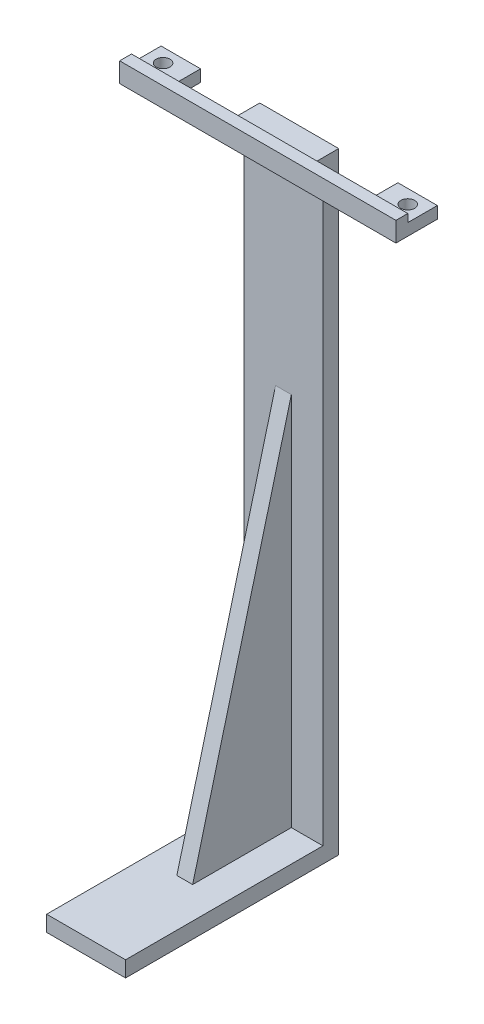
ISO-10303-21;
HEADER;
FILE_DESCRIPTION(('STEP AP214'),'2;1');
FILE_NAME('part.step','',(''),(''),'','','');
FILE_SCHEMA(('AUTOMOTIVE_DESIGN { 1 0 10303 214 1 1 1 1 }'));
ENDSEC;
DATA;
#1=APPLICATION_CONTEXT('core data for automotive mechanical design processes');
#2=APPLICATION_PROTOCOL_DEFINITION('international standard','automotive_design',2000,#1);
#3=PRODUCT_CONTEXT('',#1,'mechanical');
#4=PRODUCT('Part','Part','',(#3));
#5=PRODUCT_RELATED_PRODUCT_CATEGORY('part','',(#4));
#6=PRODUCT_DEFINITION_FORMATION('','',#4);
#7=PRODUCT_DEFINITION_CONTEXT('part definition',#1,'design');
#8=PRODUCT_DEFINITION('design','',#6,#7);
#9=PRODUCT_DEFINITION_SHAPE('','',#8);
#10=(LENGTH_UNIT() NAMED_UNIT(*) SI_UNIT(.MILLI.,.METRE.));
#11=(NAMED_UNIT(*) PLANE_ANGLE_UNIT() SI_UNIT($,.RADIAN.));
#12=(NAMED_UNIT(*) SI_UNIT($,.STERADIAN.) SOLID_ANGLE_UNIT());
#13=UNCERTAINTY_MEASURE_WITH_UNIT(LENGTH_MEASURE(1.E-05),#10,'distance_accuracy_value','');
#14=(GEOMETRIC_REPRESENTATION_CONTEXT(3) GLOBAL_UNCERTAINTY_ASSIGNED_CONTEXT((#13)) GLOBAL_UNIT_ASSIGNED_CONTEXT((#10,
#11,#12)) REPRESENTATION_CONTEXT('',''));
#15=CARTESIAN_POINT('',(0.,0.,0.));
#16=DIRECTION('',(0.,0.,1.));
#17=DIRECTION('',(1.,0.,0.));
#18=AXIS2_PLACEMENT_3D('',#15,#16,#17);
#19=CARTESIAN_POINT('',(0.,0.,7.5));
#20=DIRECTION('',(0.,0.,1.));
#21=DIRECTION('',(1.,0.,0.));
#22=AXIS2_PLACEMENT_3D('',#19,#20,#21);
#23=PLANE('',#22);
#24=DIRECTION('',(0.,1.,0.));
#25=VECTOR('',#24,1.);
#26=CARTESIAN_POINT('',(25.,74.5,7.5));
#27=LINE('',#26,#25);
#28=CARTESIAN_POINT('',(25.,74.5,7.5));
#29=VERTEX_POINT('',#28);
#30=CARTESIAN_POINT('',(25.,77.5,7.5));
#31=VERTEX_POINT('',#30);
#32=EDGE_CURVE('E200',#29,#31,#27,.T.);
#33=ORIENTED_EDGE('',*,*,#32,.F.);
#34=DIRECTION('',(1.,0.,0.));
#35=VECTOR('',#34,1.);
#36=CARTESIAN_POINT('',(-35.,74.5,7.5));
#37=LINE('',#36,#35);
#38=CARTESIAN_POINT('',(9.99999999999999,74.5,7.5));
#39=VERTEX_POINT('',#38);
#40=EDGE_CURVE('E249',#39,#29,#37,.T.);
#41=ORIENTED_EDGE('',*,*,#40,.F.);
#42=DIRECTION('',(0.,1.,0.));
#43=VECTOR('',#42,1.);
#44=CARTESIAN_POINT('',(9.99999999999999,77.5,7.5));
#45=LINE('',#44,#43);
#46=CARTESIAN_POINT('',(9.99999999999999,77.5,7.5));
#47=VERTEX_POINT('',#46);
#48=EDGE_CURVE('E260',#39,#47,#45,.T.);
#49=ORIENTED_EDGE('',*,*,#48,.T.);
#50=DIRECTION('',(-1.,0.,0.));
#51=VECTOR('',#50,1.);
#52=CARTESIAN_POINT('',(9.99999999999999,77.5,7.5));
#53=LINE('',#52,#51);
#54=CARTESIAN_POINT('',(-10.,77.5,7.5));
#55=VERTEX_POINT('',#54);
#56=EDGE_CURVE('E263',#47,#55,#53,.T.);
#57=ORIENTED_EDGE('',*,*,#56,.T.);
#58=DIRECTION('',(0.,-1.,0.));
#59=VECTOR('',#58,1.);
#60=CARTESIAN_POINT('',(-10.,77.5,7.5));
#61=LINE('',#60,#59);
#62=CARTESIAN_POINT('',(-10.,74.5,7.5));
#63=VERTEX_POINT('',#62);
#64=EDGE_CURVE('E266',#55,#63,#61,.T.);
#65=ORIENTED_EDGE('',*,*,#64,.T.);
#66=CARTESIAN_POINT('',(-25.,74.5,7.5));
#67=VERTEX_POINT('',#66);
#68=EDGE_CURVE('E250',#67,#63,#37,.T.);
#69=ORIENTED_EDGE('',*,*,#68,.F.);
#70=DIRECTION('',(0.,-1.,0.));
#71=VECTOR('',#70,1.);
#72=CARTESIAN_POINT('',(-25.,74.5,7.5));
#73=LINE('',#72,#71);
#74=CARTESIAN_POINT('',(-25.,77.5,7.5));
#75=VERTEX_POINT('',#74);
#76=EDGE_CURVE('E219',#75,#67,#73,.T.);
#77=ORIENTED_EDGE('',*,*,#76,.F.);
#78=DIRECTION('',(1.,0.,0.));
#79=VECTOR('',#78,1.);
#80=CARTESIAN_POINT('',(-35.,77.5,7.5));
#81=LINE('',#80,#79);
#82=CARTESIAN_POINT('',(-35.,77.5,7.5));
#83=VERTEX_POINT('',#82);
#84=EDGE_CURVE('E214',#83,#75,#81,.T.);
#85=ORIENTED_EDGE('',*,*,#84,.F.);
#86=DIRECTION('',(0.,-1.,0.));
#87=VECTOR('',#86,1.);
#88=CARTESIAN_POINT('',(-35.,79.5,7.5));
#89=LINE('',#88,#87);
#90=CARTESIAN_POINT('',(-35.,79.5,7.5));
#91=VERTEX_POINT('',#90);
#92=EDGE_CURVE('E236',#91,#83,#89,.T.);
#93=ORIENTED_EDGE('',*,*,#92,.F.);
#94=DIRECTION('',(-1.,0.,0.));
#95=VECTOR('',#94,1.);
#96=CARTESIAN_POINT('',(-35.,79.5,7.5));
#97=LINE('',#96,#95);
#98=CARTESIAN_POINT('',(35.,79.5,7.5));
#99=VERTEX_POINT('',#98);
#100=EDGE_CURVE('E241',#99,#91,#97,.T.);
#101=ORIENTED_EDGE('',*,*,#100,.F.);
#102=DIRECTION('',(0.,1.,0.));
#103=VECTOR('',#102,1.);
#104=CARTESIAN_POINT('',(35.,79.5,7.5));
#105=LINE('',#104,#103);
#106=CARTESIAN_POINT('',(35.,77.5,7.5));
#107=VERTEX_POINT('',#106);
#108=EDGE_CURVE('E252',#107,#99,#105,.T.);
#109=ORIENTED_EDGE('',*,*,#108,.F.);
#110=DIRECTION('',(1.,0.,0.));
#111=VECTOR('',#110,1.);
#112=CARTESIAN_POINT('',(35.,77.5,7.5));
#113=LINE('',#112,#111);
#114=EDGE_CURVE('E198',#31,#107,#113,.T.);
#115=ORIENTED_EDGE('',*,*,#114,.F.);
#116=EDGE_LOOP('',(#33,#41,#49,#57,#65,#69,#77,#85,#93,#101,#109,#115));
#117=FACE_BOUND('',#116,.T.);
#118=ADVANCED_FACE('F33',(#117),#23,.F.);
#119=CARTESIAN_POINT('',(0.,0.,4.));
#120=DIRECTION('',(0.,0.,-1.));
#121=DIRECTION('',(-1.,0.,0.));
#122=AXIS2_PLACEMENT_3D('',#119,#120,#121);
#123=PLANE('',#122);
#124=DIRECTION('',(1.,0.,0.));
#125=VECTOR('',#124,1.);
#126=CARTESIAN_POINT('',(9.99999999999999,74.5,4.));
#127=LINE('',#126,#125);
#128=CARTESIAN_POINT('',(-10.,74.5,4.));
#129=VERTEX_POINT('',#128);
#130=CARTESIAN_POINT('',(9.99999999999999,74.5,4.));
#131=VERTEX_POINT('',#130);
#132=EDGE_CURVE('E56',#129,#131,#127,.T.);
#133=ORIENTED_EDGE('',*,*,#132,.F.);
#134=DIRECTION('',(0.,-1.,0.));
#135=VECTOR('',#134,1.);
#136=CARTESIAN_POINT('',(-10.,77.5,4.));
#137=LINE('',#136,#135);
#138=CARTESIAN_POINT('',(-9.99999999999999,-73.5,4.));
#139=VERTEX_POINT('',#138);
#140=EDGE_CURVE('E312',#129,#139,#137,.T.);
#141=ORIENTED_EDGE('',*,*,#140,.T.);
#142=DIRECTION('',(1.,0.,0.));
#143=VECTOR('',#142,1.);
#144=CARTESIAN_POINT('',(-9.99999999999999,-73.5,4.));
#145=LINE('',#144,#143);
#146=CARTESIAN_POINT('',(-2.,-73.5,4.));
#147=VERTEX_POINT('',#146);
#148=EDGE_CURVE('E295',#139,#147,#145,.T.);
#149=ORIENTED_EDGE('',*,*,#148,.T.);
#150=DIRECTION('',(0.,-1.,0.));
#151=VECTOR('',#150,1.);
#152=CARTESIAN_POINT('',(-2.,0.,4.));
#153=LINE('',#152,#151);
#154=CARTESIAN_POINT('',(-2.,21.5000000000001,3.99999999999999));
#155=VERTEX_POINT('',#154);
#156=EDGE_CURVE('E280',#155,#147,#153,.T.);
#157=ORIENTED_EDGE('',*,*,#156,.F.);
#158=DIRECTION('',(-1.,0.,0.));
#159=VECTOR('',#158,1.);
#160=CARTESIAN_POINT('',(0.,21.5,4.));
#161=LINE('',#160,#159);
#162=CARTESIAN_POINT('',(2.,21.5000000000001,3.99999999999999));
#163=VERTEX_POINT('',#162);
#164=EDGE_CURVE('E287',#155,#163,#161,.F.);
#165=ORIENTED_EDGE('',*,*,#164,.T.);
#166=DIRECTION('',(0.,-1.,0.));
#167=VECTOR('',#166,1.);
#168=CARTESIAN_POINT('',(2.,0.,4.));
#169=LINE('',#168,#167);
#170=CARTESIAN_POINT('',(2.,-73.5,4.));
#171=VERTEX_POINT('',#170);
#172=EDGE_CURVE('E284',#163,#171,#169,.T.);
#173=ORIENTED_EDGE('',*,*,#172,.T.);
#174=CARTESIAN_POINT('',(10.,-73.5,4.));
#175=VERTEX_POINT('',#174);
#176=EDGE_CURVE('E290',#171,#175,#145,.T.);
#177=ORIENTED_EDGE('',*,*,#176,.T.);
#178=DIRECTION('',(0.,1.,0.));
#179=VECTOR('',#178,1.);
#180=CARTESIAN_POINT('',(9.99999999999999,77.5,4.));
#181=LINE('',#180,#179);
#182=EDGE_CURVE('E314',#175,#131,#181,.T.);
#183=ORIENTED_EDGE('',*,*,#182,.T.);
#184=EDGE_LOOP('',(#133,#141,#149,#157,#165,#173,#177,#183));
#185=FACE_BOUND('',#184,.T.);
#186=ADVANCED_FACE('F351',(#185),#123,.F.);
#187=CARTESIAN_POINT('',(-10.,77.5,4.));
#188=DIRECTION('',(1.,0.,0.));
#189=DIRECTION('',(0.,1.,0.));
#190=AXIS2_PLACEMENT_3D('',#187,#188,#189);
#191=PLANE('',#190);
#192=DIRECTION('',(0.,-1.,0.));
#193=VECTOR('',#192,1.);
#194=CARTESIAN_POINT('',(-10.,77.5,0.));
#195=LINE('',#194,#193);
#196=CARTESIAN_POINT('',(-10.,77.5,0.));
#197=VERTEX_POINT('',#196);
#198=CARTESIAN_POINT('',(-9.99999999999999,-77.5,0.));
#199=VERTEX_POINT('',#198);
#200=EDGE_CURVE('E309',#197,#199,#195,.T.);
#201=ORIENTED_EDGE('',*,*,#200,.T.);
#202=DIRECTION('',(0.,0.,-1.));
#203=VECTOR('',#202,1.);
#204=CARTESIAN_POINT('',(-9.99999999999999,-77.5,4.));
#205=LINE('',#204,#203);
#206=CARTESIAN_POINT('',(-9.99999999999999,-77.5,54.));
#207=VERTEX_POINT('',#206);
#208=EDGE_CURVE('E333',#207,#199,#205,.T.);
#209=ORIENTED_EDGE('',*,*,#208,.F.);
#210=DIRECTION('',(0.,1.,0.));
#211=VECTOR('',#210,1.);
#212=CARTESIAN_POINT('',(-9.99999999999999,-77.5,54.));
#213=LINE('',#212,#211);
#214=CARTESIAN_POINT('',(-9.99999999999999,-73.5,54.));
#215=VERTEX_POINT('',#214);
#216=EDGE_CURVE('E291',#207,#215,#213,.T.);
#217=ORIENTED_EDGE('',*,*,#216,.T.);
#218=DIRECTION('',(0.,0.,-1.));
#219=VECTOR('',#218,1.);
#220=CARTESIAN_POINT('',(-9.99999999999999,-73.5,54.));
#221=LINE('',#220,#219);
#222=EDGE_CURVE('E303',#215,#139,#221,.T.);
#223=ORIENTED_EDGE('',*,*,#222,.T.);
#224=ORIENTED_EDGE('',*,*,#140,.F.);
#225=DIRECTION('',(0.,0.,-1.));
#226=VECTOR('',#225,1.);
#227=CARTESIAN_POINT('',(-10.,74.5,7.5));
#228=LINE('',#227,#226);
#229=EDGE_CURVE('E273',#63,#129,#228,.T.);
#230=ORIENTED_EDGE('',*,*,#229,.F.);
#231=ORIENTED_EDGE('',*,*,#64,.F.);
#232=DIRECTION('',(0.,0.,-1.));
#233=VECTOR('',#232,1.);
#234=CARTESIAN_POINT('',(-10.,77.5,4.));
#235=LINE('',#234,#233);
#236=EDGE_CURVE('E317',#55,#197,#235,.T.);
#237=ORIENTED_EDGE('',*,*,#236,.T.);
#238=EDGE_LOOP('',(#201,#209,#217,#223,#224,#230,#231,#237));
#239=FACE_BOUND('',#238,.T.);
#240=ADVANCED_FACE('F35',(#239),#191,.F.);
#241=CARTESIAN_POINT('',(10.,-77.5,4.));
#242=DIRECTION('',(0.,1.,0.));
#243=DIRECTION('',(0.,0.,1.));
#244=AXIS2_PLACEMENT_3D('',#241,#242,#243);
#245=PLANE('',#244);
#246=DIRECTION('',(1.,0.,0.));
#247=VECTOR('',#246,1.);
#248=CARTESIAN_POINT('',(10.,-77.5,0.));
#249=LINE('',#248,#247);
#250=CARTESIAN_POINT('',(10.,-77.5,0.));
#251=VERTEX_POINT('',#250);
#252=EDGE_CURVE('E320',#199,#251,#249,.T.);
#253=ORIENTED_EDGE('',*,*,#252,.T.);
#254=DIRECTION('',(0.,0.,-1.));
#255=VECTOR('',#254,1.);
#256=CARTESIAN_POINT('',(10.,-77.5,4.));
#257=LINE('',#256,#255);
#258=CARTESIAN_POINT('',(10.,-77.5,54.));
#259=VERTEX_POINT('',#258);
#260=EDGE_CURVE('E330',#259,#251,#257,.T.);
#261=ORIENTED_EDGE('',*,*,#260,.F.);
#262=DIRECTION('',(1.,0.,0.));
#263=VECTOR('',#262,1.);
#264=CARTESIAN_POINT('',(-9.99999999999999,-77.5,54.));
#265=LINE('',#264,#263);
#266=EDGE_CURVE('E300',#207,#259,#265,.T.);
#267=ORIENTED_EDGE('',*,*,#266,.F.);
#268=ORIENTED_EDGE('',*,*,#208,.T.);
#269=EDGE_LOOP('',(#253,#261,#267,#268));
#270=FACE_BOUND('',#269,.T.);
#271=ADVANCED_FACE('F414',(#270),#245,.F.);
#272=CARTESIAN_POINT('',(9.99999999999999,77.5,4.));
#273=DIRECTION('',(-1.,0.,0.));
#274=DIRECTION('',(0.,-1.,0.));
#275=AXIS2_PLACEMENT_3D('',#272,#273,#274);
#276=PLANE('',#275);
#277=DIRECTION('',(0.,1.,0.));
#278=VECTOR('',#277,1.);
#279=CARTESIAN_POINT('',(9.99999999999999,77.5,0.));
#280=LINE('',#279,#278);
#281=CARTESIAN_POINT('',(9.99999999999999,77.5,0.));
#282=VERTEX_POINT('',#281);
#283=EDGE_CURVE('E322',#251,#282,#280,.T.);
#284=ORIENTED_EDGE('',*,*,#283,.T.);
#285=DIRECTION('',(0.,0.,-1.));
#286=VECTOR('',#285,1.);
#287=CARTESIAN_POINT('',(9.99999999999999,77.5,4.));
#288=LINE('',#287,#286);
#289=EDGE_CURVE('E327',#47,#282,#288,.T.);
#290=ORIENTED_EDGE('',*,*,#289,.F.);
#291=ORIENTED_EDGE('',*,*,#48,.F.);
#292=DIRECTION('',(0.,0.,-1.));
#293=VECTOR('',#292,1.);
#294=CARTESIAN_POINT('',(9.99999999999999,74.5,7.5));
#295=LINE('',#294,#293);
#296=EDGE_CURVE('E269',#39,#131,#295,.T.);
#297=ORIENTED_EDGE('',*,*,#296,.T.);
#298=ORIENTED_EDGE('',*,*,#182,.F.);
#299=DIRECTION('',(0.,0.,-1.));
#300=VECTOR('',#299,1.);
#301=CARTESIAN_POINT('',(10.,-73.5,54.));
#302=LINE('',#301,#300);
#303=CARTESIAN_POINT('',(10.,-73.5,54.));
#304=VERTEX_POINT('',#303);
#305=EDGE_CURVE('E306',#304,#175,#302,.T.);
#306=ORIENTED_EDGE('',*,*,#305,.F.);
#307=DIRECTION('',(0.,1.,0.));
#308=VECTOR('',#307,1.);
#309=CARTESIAN_POINT('',(10.,-77.5,54.));
#310=LINE('',#309,#308);
#311=EDGE_CURVE('E298',#259,#304,#310,.T.);
#312=ORIENTED_EDGE('',*,*,#311,.F.);
#313=ORIENTED_EDGE('',*,*,#260,.T.);
#314=EDGE_LOOP('',(#284,#290,#291,#297,#298,#306,#312,#313));
#315=FACE_BOUND('',#314,.T.);
#316=ADVANCED_FACE('F365',(#315),#276,.F.);
#317=CARTESIAN_POINT('',(9.99999999999999,77.5,4.));
#318=DIRECTION('',(0.,-1.,0.));
#319=DIRECTION('',(0.,0.,-1.));
#320=AXIS2_PLACEMENT_3D('',#317,#318,#319);
#321=PLANE('',#320);
#322=DIRECTION('',(-1.,0.,0.));
#323=VECTOR('',#322,1.);
#324=CARTESIAN_POINT('',(9.99999999999999,77.5,0.));
#325=LINE('',#324,#323);
#326=EDGE_CURVE('E315',#282,#197,#325,.T.);
#327=ORIENTED_EDGE('',*,*,#326,.T.);
#328=ORIENTED_EDGE('',*,*,#236,.F.);
#329=ORIENTED_EDGE('',*,*,#56,.F.);
#330=ORIENTED_EDGE('',*,*,#289,.T.);
#331=EDGE_LOOP('',(#327,#328,#329,#330));
#332=FACE_BOUND('',#331,.T.);
#333=ADVANCED_FACE('F407',(#332),#321,.F.);
#334=CARTESIAN_POINT('',(0.,0.,0.));
#335=DIRECTION('',(0.,0.,-1.));
#336=DIRECTION('',(-1.,0.,0.));
#337=AXIS2_PLACEMENT_3D('',#334,#335,#336);
#338=PLANE('',#337);
#339=ORIENTED_EDGE('',*,*,#283,.F.);
#340=ORIENTED_EDGE('',*,*,#252,.F.);
#341=ORIENTED_EDGE('',*,*,#200,.F.);
#342=ORIENTED_EDGE('',*,*,#326,.F.);
#343=EDGE_LOOP('',(#339,#340,#341,#342));
#344=FACE_BOUND('',#343,.T.);
#345=ADVANCED_FACE('F412',(#344),#338,.T.);
#346=CARTESIAN_POINT('',(-9.99999999999999,-73.5,54.));
#347=DIRECTION('',(0.,1.,0.));
#348=DIRECTION('',(0.,0.,1.));
#349=AXIS2_PLACEMENT_3D('',#346,#347,#348);
#350=PLANE('',#349);
#351=DIRECTION('',(0.,0.,-1.));
#352=VECTOR('',#351,1.);
#353=CARTESIAN_POINT('',(2.,-73.5,54.));
#354=LINE('',#353,#352);
#355=CARTESIAN_POINT('',(2.,-73.5,29.));
#356=VERTEX_POINT('',#355);
#357=EDGE_CURVE('E11',#356,#171,#354,.T.);
#358=ORIENTED_EDGE('',*,*,#357,.F.);
#359=DIRECTION('',(-1.,0.,0.));
#360=VECTOR('',#359,1.);
#361=CARTESIAN_POINT('',(-9.99999999999999,-73.5,29.));
#362=LINE('',#361,#360);
#363=CARTESIAN_POINT('',(-2.,-73.5,29.));
#364=VERTEX_POINT('',#363);
#365=EDGE_CURVE('E41',#364,#356,#362,.F.);
#366=ORIENTED_EDGE('',*,*,#365,.F.);
#367=DIRECTION('',(0.,0.,-1.));
#368=VECTOR('',#367,1.);
#369=CARTESIAN_POINT('',(-2.,-73.5,54.));
#370=LINE('',#369,#368);
#371=EDGE_CURVE('E336',#364,#147,#370,.T.);
#372=ORIENTED_EDGE('',*,*,#371,.T.);
#373=ORIENTED_EDGE('',*,*,#148,.F.);
#374=ORIENTED_EDGE('',*,*,#222,.F.);
#375=DIRECTION('',(1.,0.,0.));
#376=VECTOR('',#375,1.);
#377=CARTESIAN_POINT('',(-9.99999999999999,-73.5,54.));
#378=LINE('',#377,#376);
#379=EDGE_CURVE('E294',#215,#304,#378,.T.);
#380=ORIENTED_EDGE('',*,*,#379,.T.);
#381=ORIENTED_EDGE('',*,*,#305,.T.);
#382=ORIENTED_EDGE('',*,*,#176,.F.);
#383=EDGE_LOOP('',(#358,#366,#372,#373,#374,#380,#381,#382));
#384=FACE_BOUND('',#383,.T.);
#385=ADVANCED_FACE('F348',(#384),#350,.T.);
#386=CARTESIAN_POINT('',(0.,0.,54.));
#387=DIRECTION('',(0.,0.,-1.));
#388=DIRECTION('',(-1.,0.,0.));
#389=AXIS2_PLACEMENT_3D('',#386,#387,#388);
#390=PLANE('',#389);
#391=ORIENTED_EDGE('',*,*,#216,.F.);
#392=ORIENTED_EDGE('',*,*,#266,.T.);
#393=ORIENTED_EDGE('',*,*,#311,.T.);
#394=ORIENTED_EDGE('',*,*,#379,.F.);
#395=EDGE_LOOP('',(#391,#392,#393,#394));
#396=FACE_BOUND('',#395,.T.);
#397=ADVANCED_FACE('F361',(#396),#390,.F.);
#398=CARTESIAN_POINT('',(0.,-73.5,29.));
#399=DIRECTION('',(0.,-0.254493299279644,-0.967074537262647));
#400=DIRECTION('',(0.,0.967074537262646,-0.254493299279644));
#401=AXIS2_PLACEMENT_3D('',#398,#399,#400);
#402=PLANE('',#401);
#403=ORIENTED_EDGE('',*,*,#164,.F.);
#404=DIRECTION('',(0.,0.967074537262646,-0.254493299279644));
#405=VECTOR('',#404,1.);
#406=CARTESIAN_POINT('',(-2.,-73.5,29.));
#407=LINE('',#406,#405);
#408=EDGE_CURVE('E276',#364,#155,#407,.T.);
#409=ORIENTED_EDGE('',*,*,#408,.F.);
#410=ORIENTED_EDGE('',*,*,#365,.T.);
#411=DIRECTION('',(0.,0.967074537262646,-0.254493299279644));
#412=VECTOR('',#411,1.);
#413=CARTESIAN_POINT('',(2.,-73.5,29.));
#414=LINE('',#413,#412);
#415=EDGE_CURVE('E277',#356,#163,#414,.T.);
#416=ORIENTED_EDGE('',*,*,#415,.T.);
#417=EDGE_LOOP('',(#403,#409,#410,#416));
#418=FACE_BOUND('',#417,.T.);
#419=ADVANCED_FACE('F342',(#418),#402,.F.);
#420=CARTESIAN_POINT('',(2.,0.,27.));
#421=DIRECTION('',(1.,0.,0.));
#422=DIRECTION('',(0.,0.,-1.));
#423=AXIS2_PLACEMENT_3D('',#420,#421,#422);
#424=PLANE('',#423);
#425=ORIENTED_EDGE('',*,*,#172,.F.);
#426=ORIENTED_EDGE('',*,*,#415,.F.);
#427=ORIENTED_EDGE('',*,*,#357,.T.);
#428=EDGE_LOOP('',(#425,#426,#427));
#429=FACE_BOUND('',#428,.T.);
#430=ADVANCED_FACE('F346',(#429),#424,.T.);
#431=CARTESIAN_POINT('',(-2.,0.,27.));
#432=DIRECTION('',(1.,0.,0.));
#433=DIRECTION('',(0.,0.,-1.));
#434=AXIS2_PLACEMENT_3D('',#431,#432,#433);
#435=PLANE('',#434);
#436=ORIENTED_EDGE('',*,*,#408,.T.);
#437=ORIENTED_EDGE('',*,*,#156,.T.);
#438=ORIENTED_EDGE('',*,*,#371,.F.);
#439=EDGE_LOOP('',(#436,#437,#438));
#440=FACE_BOUND('',#439,.T.);
#441=ADVANCED_FACE('F354',(#440),#435,.F.);
#442=CARTESIAN_POINT('',(9.99999999999999,74.5,7.5));
#443=DIRECTION('',(0.,1.,0.));
#444=DIRECTION('',(0.,0.,1.));
#445=AXIS2_PLACEMENT_3D('',#442,#443,#444);
#446=PLANE('',#445);
#447=CARTESIAN_POINT('',(-31.,74.5,3.5));
#448=DIRECTION('',(0.,1.,0.));
#449=DIRECTION('',(0.,0.,1.));
#450=AXIS2_PLACEMENT_3D('',#447,#448,#449);
#451=CIRCLE('',#450,1.75);
#452=CARTESIAN_POINT('',(-31.,74.5,5.25));
#453=VERTEX_POINT('',#452);
#454=EDGE_CURVE('E203',#453,#453,#451,.T.);
#455=ORIENTED_EDGE('',*,*,#454,.T.);
#456=EDGE_LOOP('',(#455));
#457=FACE_BOUND('',#456,.T.);
#458=CARTESIAN_POINT('',(31.,74.5,3.5));
#459=DIRECTION('',(0.,1.,0.));
#460=DIRECTION('',(0.,0.,1.));
#461=AXIS2_PLACEMENT_3D('',#458,#459,#460);
#462=CIRCLE('',#461,1.75000000000001);
#463=CARTESIAN_POINT('',(31.,74.5,5.25000000000001));
#464=VERTEX_POINT('',#463);
#465=EDGE_CURVE('E659',#464,#464,#462,.T.);
#466=ORIENTED_EDGE('',*,*,#465,.T.);
#467=EDGE_LOOP('',(#466));
#468=FACE_BOUND('',#467,.T.);
#469=ORIENTED_EDGE('',*,*,#132,.T.);
#470=ORIENTED_EDGE('',*,*,#296,.F.);
#471=ORIENTED_EDGE('',*,*,#40,.T.);
#472=DIRECTION('',(0.,0.,1.));
#473=VECTOR('',#472,1.);
#474=CARTESIAN_POINT('',(25.,74.5,0.));
#475=LINE('',#474,#473);
#476=CARTESIAN_POINT('',(25.,74.5,0.));
#477=VERTEX_POINT('',#476);
#478=EDGE_CURVE('E190',#477,#29,#475,.T.);
#479=ORIENTED_EDGE('',*,*,#478,.F.);
#480=DIRECTION('',(-1.,0.,0.));
#481=VECTOR('',#480,1.);
#482=CARTESIAN_POINT('',(35.,74.5,0.));
#483=LINE('',#482,#481);
#484=CARTESIAN_POINT('',(35.,74.5,0.));
#485=VERTEX_POINT('',#484);
#486=EDGE_CURVE('E187',#485,#477,#483,.T.);
#487=ORIENTED_EDGE('',*,*,#486,.F.);
#488=DIRECTION('',(0.,0.,-1.));
#489=VECTOR('',#488,1.);
#490=CARTESIAN_POINT('',(35.,74.5,10.5));
#491=LINE('',#490,#489);
#492=CARTESIAN_POINT('',(35.,74.5,10.5));
#493=VERTEX_POINT('',#492);
#494=EDGE_CURVE('E175',#493,#485,#491,.T.);
#495=ORIENTED_EDGE('',*,*,#494,.F.);
#496=DIRECTION('',(1.,0.,0.));
#497=VECTOR('',#496,1.);
#498=CARTESIAN_POINT('',(-35.,74.5,10.5));
#499=LINE('',#498,#497);
#500=CARTESIAN_POINT('',(-35.,74.5,10.5));
#501=VERTEX_POINT('',#500);
#502=EDGE_CURVE('E240',#501,#493,#499,.T.);
#503=ORIENTED_EDGE('',*,*,#502,.F.);
#504=DIRECTION('',(0.,0.,-1.));
#505=VECTOR('',#504,1.);
#506=CARTESIAN_POINT('',(-35.,74.5,10.5));
#507=LINE('',#506,#505);
#508=CARTESIAN_POINT('',(-35.,74.5,0.));
#509=VERTEX_POINT('',#508);
#510=EDGE_CURVE('E183',#501,#509,#507,.T.);
#511=ORIENTED_EDGE('',*,*,#510,.T.);
#512=DIRECTION('',(-1.,0.,0.));
#513=VECTOR('',#512,1.);
#514=CARTESIAN_POINT('',(-35.,74.5,0.));
#515=LINE('',#514,#513);
#516=CARTESIAN_POINT('',(-25.,74.5,0.));
#517=VERTEX_POINT('',#516);
#518=EDGE_CURVE('E223',#517,#509,#515,.T.);
#519=ORIENTED_EDGE('',*,*,#518,.F.);
#520=DIRECTION('',(0.,0.,1.));
#521=VECTOR('',#520,1.);
#522=CARTESIAN_POINT('',(-25.,74.5,0.));
#523=LINE('',#522,#521);
#524=EDGE_CURVE('E226',#517,#67,#523,.T.);
#525=ORIENTED_EDGE('',*,*,#524,.T.);
#526=ORIENTED_EDGE('',*,*,#68,.T.);
#527=ORIENTED_EDGE('',*,*,#229,.T.);
#528=EDGE_LOOP('',(#469,#470,#471,#479,#487,#495,#503,#511,#519,#525,#526,#527));
#529=FACE_BOUND('',#528,.T.);
#530=ADVANCED_FACE('F188',(#457,#468,#529),#446,.F.);
#531=CARTESIAN_POINT('',(-35.,79.5,10.5));
#532=DIRECTION('',(1.,0.,0.));
#533=DIRECTION('',(0.,1.,0.));
#534=AXIS2_PLACEMENT_3D('',#531,#532,#533);
#535=PLANE('',#534);
#536=ORIENTED_EDGE('',*,*,#92,.T.);
#537=DIRECTION('',(0.,0.,1.));
#538=VECTOR('',#537,1.);
#539=CARTESIAN_POINT('',(-35.,77.5,0.));
#540=LINE('',#539,#538);
#541=CARTESIAN_POINT('',(-35.,77.5,0.));
#542=VERTEX_POINT('',#541);
#543=EDGE_CURVE('E234',#542,#83,#540,.T.);
#544=ORIENTED_EDGE('',*,*,#543,.F.);
#545=DIRECTION('',(0.,1.,0.));
#546=VECTOR('',#545,1.);
#547=CARTESIAN_POINT('',(-35.,74.5,0.));
#548=LINE('',#547,#546);
#549=EDGE_CURVE('E215',#509,#542,#548,.T.);
#550=ORIENTED_EDGE('',*,*,#549,.F.);
#551=ORIENTED_EDGE('',*,*,#510,.F.);
#552=DIRECTION('',(0.,-1.,0.));
#553=VECTOR('',#552,1.);
#554=CARTESIAN_POINT('',(-35.,79.5,10.5));
#555=LINE('',#554,#553);
#556=CARTESIAN_POINT('',(-35.,79.5,10.5));
#557=VERTEX_POINT('',#556);
#558=EDGE_CURVE('E237',#557,#501,#555,.T.);
#559=ORIENTED_EDGE('',*,*,#558,.F.);
#560=DIRECTION('',(0.,0.,-1.));
#561=VECTOR('',#560,1.);
#562=CARTESIAN_POINT('',(-35.,79.5,10.5));
#563=LINE('',#562,#561);
#564=EDGE_CURVE('E246',#557,#91,#563,.T.);
#565=ORIENTED_EDGE('',*,*,#564,.T.);
#566=EDGE_LOOP('',(#536,#544,#550,#551,#559,#565));
#567=FACE_BOUND('',#566,.T.);
#568=ADVANCED_FACE('F395',(#567),#535,.F.);
#569=CARTESIAN_POINT('',(35.,79.5,10.5));
#570=DIRECTION('',(-1.,0.,0.));
#571=DIRECTION('',(0.,-1.,0.));
#572=AXIS2_PLACEMENT_3D('',#569,#570,#571);
#573=PLANE('',#572);
#574=ORIENTED_EDGE('',*,*,#494,.T.);
#575=DIRECTION('',(0.,-1.,0.));
#576=VECTOR('',#575,1.);
#577=CARTESIAN_POINT('',(35.,74.5,0.));
#578=LINE('',#577,#576);
#579=CARTESIAN_POINT('',(35.,77.5,0.));
#580=VERTEX_POINT('',#579);
#581=EDGE_CURVE('E179',#580,#485,#578,.T.);
#582=ORIENTED_EDGE('',*,*,#581,.F.);
#583=DIRECTION('',(0.,0.,1.));
#584=VECTOR('',#583,1.);
#585=CARTESIAN_POINT('',(35.,77.5,0.));
#586=LINE('',#585,#584);
#587=EDGE_CURVE('E48',#580,#107,#586,.T.);
#588=ORIENTED_EDGE('',*,*,#587,.T.);
#589=ORIENTED_EDGE('',*,*,#108,.T.);
#590=DIRECTION('',(0.,0.,-1.));
#591=VECTOR('',#590,1.);
#592=CARTESIAN_POINT('',(35.,79.5,10.5));
#593=LINE('',#592,#591);
#594=CARTESIAN_POINT('',(35.,79.5,10.5));
#595=VERTEX_POINT('',#594);
#596=EDGE_CURVE('E184',#595,#99,#593,.T.);
#597=ORIENTED_EDGE('',*,*,#596,.F.);
#598=DIRECTION('',(0.,1.,0.));
#599=VECTOR('',#598,1.);
#600=CARTESIAN_POINT('',(35.,79.5,10.5));
#601=LINE('',#600,#599);
#602=EDGE_CURVE('E181',#493,#595,#601,.T.);
#603=ORIENTED_EDGE('',*,*,#602,.F.);
#604=EDGE_LOOP('',(#574,#582,#588,#589,#597,#603));
#605=FACE_BOUND('',#604,.T.);
#606=ADVANCED_FACE('F177',(#605),#573,.F.);
#607=CARTESIAN_POINT('',(-35.,79.5,10.5));
#608=DIRECTION('',(0.,-1.,0.));
#609=DIRECTION('',(1.,0.,0.));
#610=AXIS2_PLACEMENT_3D('',#607,#608,#609);
#611=PLANE('',#610);
#612=ORIENTED_EDGE('',*,*,#100,.T.);
#613=ORIENTED_EDGE('',*,*,#564,.F.);
#614=DIRECTION('',(-1.,0.,0.));
#615=VECTOR('',#614,1.);
#616=CARTESIAN_POINT('',(-35.,79.5,10.5));
#617=LINE('',#616,#615);
#618=EDGE_CURVE('E244',#595,#557,#617,.T.);
#619=ORIENTED_EDGE('',*,*,#618,.F.);
#620=ORIENTED_EDGE('',*,*,#596,.T.);
#621=EDGE_LOOP('',(#612,#613,#619,#620));
#622=FACE_BOUND('',#621,.T.);
#623=ADVANCED_FACE('F381',(#622),#611,.F.);
#624=CARTESIAN_POINT('',(0.,0.,10.5));
#625=DIRECTION('',(0.,0.,1.));
#626=DIRECTION('',(1.,0.,0.));
#627=AXIS2_PLACEMENT_3D('',#624,#625,#626);
#628=PLANE('',#627);
#629=ORIENTED_EDGE('',*,*,#558,.T.);
#630=ORIENTED_EDGE('',*,*,#502,.T.);
#631=ORIENTED_EDGE('',*,*,#602,.T.);
#632=ORIENTED_EDGE('',*,*,#618,.T.);
#633=EDGE_LOOP('',(#629,#630,#631,#632));
#634=FACE_BOUND('',#633,.T.);
#635=ADVANCED_FACE('F385',(#634),#628,.T.);
#636=CARTESIAN_POINT('',(-35.,77.5,0.));
#637=DIRECTION('',(0.,-1.,0.));
#638=DIRECTION('',(0.,0.,-1.));
#639=AXIS2_PLACEMENT_3D('',#636,#637,#638);
#640=PLANE('',#639);
#641=CARTESIAN_POINT('',(-31.,77.5,3.5));
#642=DIRECTION('',(0.,1.,0.));
#643=DIRECTION('',(0.,0.,1.));
#644=AXIS2_PLACEMENT_3D('',#641,#642,#643);
#645=CIRCLE('',#644,1.75);
#646=CARTESIAN_POINT('',(-31.,77.5,5.25));
#647=VERTEX_POINT('',#646);
#648=EDGE_CURVE('E656',#647,#647,#645,.T.);
#649=ORIENTED_EDGE('',*,*,#648,.F.);
#650=EDGE_LOOP('',(#649));
#651=FACE_BOUND('',#650,.T.);
#652=ORIENTED_EDGE('',*,*,#84,.T.);
#653=DIRECTION('',(0.,0.,1.));
#654=VECTOR('',#653,1.);
#655=CARTESIAN_POINT('',(-25.,77.5,0.));
#656=LINE('',#655,#654);
#657=CARTESIAN_POINT('',(-25.,77.5,0.));
#658=VERTEX_POINT('',#657);
#659=EDGE_CURVE('E231',#658,#75,#656,.T.);
#660=ORIENTED_EDGE('',*,*,#659,.F.);
#661=DIRECTION('',(1.,0.,0.));
#662=VECTOR('',#661,1.);
#663=CARTESIAN_POINT('',(-35.,77.5,0.));
#664=LINE('',#663,#662);
#665=EDGE_CURVE('E218',#542,#658,#664,.T.);
#666=ORIENTED_EDGE('',*,*,#665,.F.);
#667=ORIENTED_EDGE('',*,*,#543,.T.);
#668=EDGE_LOOP('',(#652,#660,#666,#667));
#669=FACE_BOUND('',#668,.T.);
#670=ADVANCED_FACE('F398',(#651,#669),#640,.F.);
#671=CARTESIAN_POINT('',(-25.,74.5,0.));
#672=DIRECTION('',(-1.,0.,0.));
#673=DIRECTION('',(0.,0.,1.));
#674=AXIS2_PLACEMENT_3D('',#671,#672,#673);
#675=PLANE('',#674);
#676=ORIENTED_EDGE('',*,*,#76,.T.);
#677=ORIENTED_EDGE('',*,*,#524,.F.);
#678=DIRECTION('',(0.,-1.,0.));
#679=VECTOR('',#678,1.);
#680=CARTESIAN_POINT('',(-25.,74.5,0.));
#681=LINE('',#680,#679);
#682=EDGE_CURVE('E221',#658,#517,#681,.T.);
#683=ORIENTED_EDGE('',*,*,#682,.F.);
#684=ORIENTED_EDGE('',*,*,#659,.T.);
#685=EDGE_LOOP('',(#676,#677,#683,#684));
#686=FACE_BOUND('',#685,.T.);
#687=ADVANCED_FACE('F403',(#686),#675,.F.);
#688=CARTESIAN_POINT('',(0.,0.,0.));
#689=DIRECTION('',(0.,0.,-1.));
#690=DIRECTION('',(-1.,0.,0.));
#691=AXIS2_PLACEMENT_3D('',#688,#689,#690);
#692=PLANE('',#691);
#693=ORIENTED_EDGE('',*,*,#549,.T.);
#694=ORIENTED_EDGE('',*,*,#665,.T.);
#695=ORIENTED_EDGE('',*,*,#682,.T.);
#696=ORIENTED_EDGE('',*,*,#518,.T.);
#697=EDGE_LOOP('',(#693,#694,#695,#696));
#698=FACE_BOUND('',#697,.T.);
#699=ADVANCED_FACE('F391',(#698),#692,.T.);
#700=CARTESIAN_POINT('',(25.,74.5,0.));
#701=DIRECTION('',(1.,0.,0.));
#702=DIRECTION('',(0.,0.,-1.));
#703=AXIS2_PLACEMENT_3D('',#700,#701,#702);
#704=PLANE('',#703);
#705=ORIENTED_EDGE('',*,*,#32,.T.);
#706=DIRECTION('',(0.,0.,1.));
#707=VECTOR('',#706,1.);
#708=CARTESIAN_POINT('',(25.,77.5,0.));
#709=LINE('',#708,#707);
#710=CARTESIAN_POINT('',(25.,77.5,0.));
#711=VERTEX_POINT('',#710);
#712=EDGE_CURVE('E210',#711,#31,#709,.T.);
#713=ORIENTED_EDGE('',*,*,#712,.F.);
#714=DIRECTION('',(0.,1.,0.));
#715=VECTOR('',#714,1.);
#716=CARTESIAN_POINT('',(25.,74.5,0.));
#717=LINE('',#716,#715);
#718=EDGE_CURVE('E193',#477,#711,#717,.T.);
#719=ORIENTED_EDGE('',*,*,#718,.F.);
#720=ORIENTED_EDGE('',*,*,#478,.T.);
#721=EDGE_LOOP('',(#705,#713,#719,#720));
#722=FACE_BOUND('',#721,.T.);
#723=ADVANCED_FACE('F374',(#722),#704,.F.);
#724=CARTESIAN_POINT('',(35.,77.5,0.));
#725=DIRECTION('',(0.,-1.,0.));
#726=DIRECTION('',(0.,0.,-1.));
#727=AXIS2_PLACEMENT_3D('',#724,#725,#726);
#728=PLANE('',#727);
#729=CARTESIAN_POINT('',(31.,77.5,3.5));
#730=DIRECTION('',(0.,1.,0.));
#731=DIRECTION('',(0.,0.,1.));
#732=AXIS2_PLACEMENT_3D('',#729,#730,#731);
#733=CIRCLE('',#732,1.75000000000001);
#734=CARTESIAN_POINT('',(31.,77.5,5.25000000000001));
#735=VERTEX_POINT('',#734);
#736=EDGE_CURVE('E663',#735,#735,#733,.T.);
#737=ORIENTED_EDGE('',*,*,#736,.F.);
#738=EDGE_LOOP('',(#737));
#739=FACE_BOUND('',#738,.T.);
#740=ORIENTED_EDGE('',*,*,#114,.T.);
#741=ORIENTED_EDGE('',*,*,#587,.F.);
#742=DIRECTION('',(1.,0.,0.));
#743=VECTOR('',#742,1.);
#744=CARTESIAN_POINT('',(35.,77.5,0.));
#745=LINE('',#744,#743);
#746=EDGE_CURVE('E197',#711,#580,#745,.T.);
#747=ORIENTED_EDGE('',*,*,#746,.F.);
#748=ORIENTED_EDGE('',*,*,#712,.T.);
#749=EDGE_LOOP('',(#740,#741,#747,#748));
#750=FACE_BOUND('',#749,.T.);
#751=ADVANCED_FACE('F376',(#739,#750),#728,.F.);
#752=CARTESIAN_POINT('',(0.,0.,0.));
#753=DIRECTION('',(0.,0.,1.));
#754=DIRECTION('',(1.,0.,0.));
#755=AXIS2_PLACEMENT_3D('',#752,#753,#754);
#756=PLANE('',#755);
#757=ORIENTED_EDGE('',*,*,#581,.T.);
#758=ORIENTED_EDGE('',*,*,#486,.T.);
#759=ORIENTED_EDGE('',*,*,#718,.T.);
#760=ORIENTED_EDGE('',*,*,#746,.T.);
#761=EDGE_LOOP('',(#757,#758,#759,#760));
#762=FACE_BOUND('',#761,.T.);
#763=ADVANCED_FACE('F195',(#762),#756,.F.);
#764=CARTESIAN_POINT('',(31.,67.5,3.5));
#765=DIRECTION('',(0.,1.,0.));
#766=DIRECTION('',(0.,0.,1.));
#767=AXIS2_PLACEMENT_3D('',#764,#765,#766);
#768=CYLINDRICAL_SURFACE('',#767,1.75000000000001);
#769=ORIENTED_EDGE('',*,*,#736,.T.);
#770=EDGE_LOOP('',(#769));
#771=FACE_BOUND('',#770,.T.);
#772=ORIENTED_EDGE('',*,*,#465,.F.);
#773=EDGE_LOOP('',(#772));
#774=FACE_BOUND('',#773,.T.);
#775=ADVANCED_FACE('F540',(#771,#774),#768,.F.);
#776=CARTESIAN_POINT('',(-31.,67.5,3.5));
#777=DIRECTION('',(0.,1.,0.));
#778=DIRECTION('',(0.,0.,1.));
#779=AXIS2_PLACEMENT_3D('',#776,#777,#778);
#780=CYLINDRICAL_SURFACE('',#779,1.75);
#781=ORIENTED_EDGE('',*,*,#648,.T.);
#782=EDGE_LOOP('',(#781));
#783=FACE_BOUND('',#782,.T.);
#784=ORIENTED_EDGE('',*,*,#454,.F.);
#785=EDGE_LOOP('',(#784));
#786=FACE_BOUND('',#785,.T.);
#787=ADVANCED_FACE('F546',(#783,#786),#780,.F.);
#788=CLOSED_SHELL('',(#118,#186,#240,#271,#316,#333,#345,#385,#397,#419,#430,#441,#530,#568,
#606,#623,#635,#670,#687,#699,#723,#751,#763,#775,#787));
#789=MANIFOLD_SOLID_BREP('B2',#788);
#790=ADVANCED_BREP_SHAPE_REPRESENTATION('',(#18,#789),#14);
#791=SHAPE_DEFINITION_REPRESENTATION(#9,#790);
ENDSEC;
END-ISO-10303-21;
